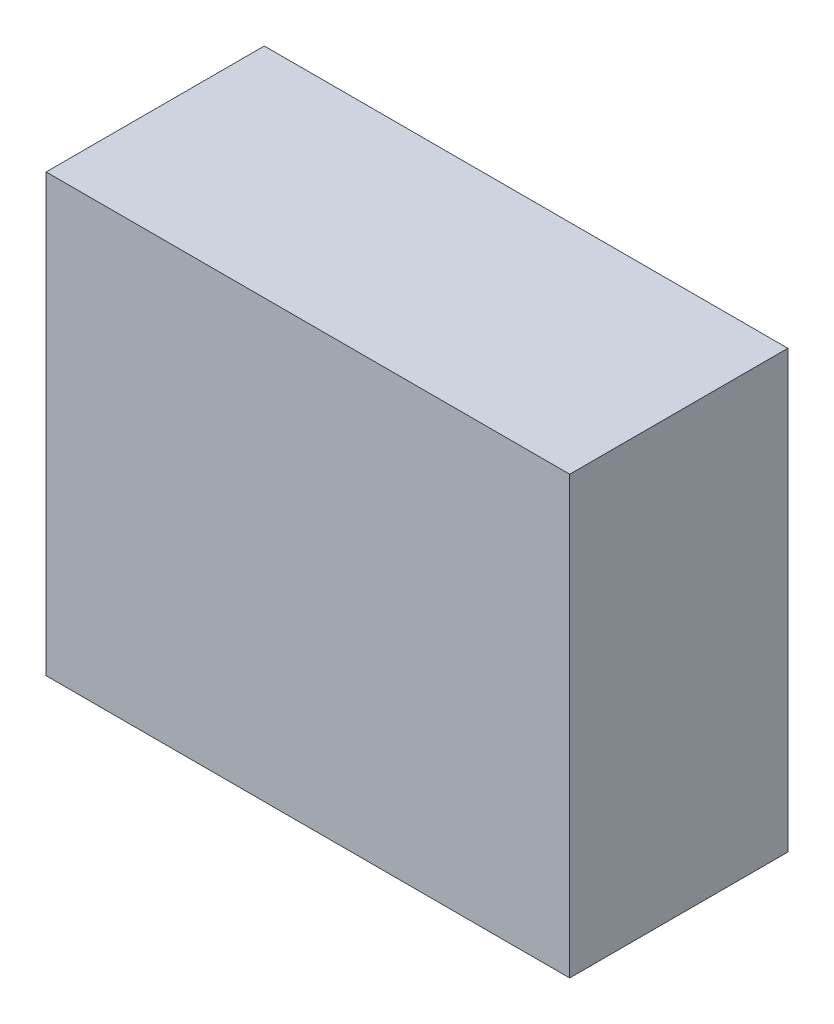
ISO-10303-21;
HEADER;
FILE_DESCRIPTION(('STEP AP214'),'2;1');
FILE_NAME('part.step','',(''),(''),'','','');
FILE_SCHEMA(('AUTOMOTIVE_DESIGN { 1 0 10303 214 1 1 1 1 }'));
ENDSEC;
DATA;
#1=APPLICATION_CONTEXT('core data for automotive mechanical design processes');
#2=APPLICATION_PROTOCOL_DEFINITION('international standard','automotive_design',2000,#1);
#3=PRODUCT_CONTEXT('',#1,'mechanical');
#4=PRODUCT('Part','Part','',(#3));
#5=PRODUCT_RELATED_PRODUCT_CATEGORY('part','',(#4));
#6=PRODUCT_DEFINITION_FORMATION('','',#4);
#7=PRODUCT_DEFINITION_CONTEXT('part definition',#1,'design');
#8=PRODUCT_DEFINITION('design','',#6,#7);
#9=PRODUCT_DEFINITION_SHAPE('','',#8);
#10=(LENGTH_UNIT() NAMED_UNIT(*) SI_UNIT(.MILLI.,.METRE.));
#11=(NAMED_UNIT(*) PLANE_ANGLE_UNIT() SI_UNIT($,.RADIAN.));
#12=(NAMED_UNIT(*) SI_UNIT($,.STERADIAN.) SOLID_ANGLE_UNIT());
#13=UNCERTAINTY_MEASURE_WITH_UNIT(LENGTH_MEASURE(1.E-05),#10,'distance_accuracy_value','');
#14=(GEOMETRIC_REPRESENTATION_CONTEXT(3) GLOBAL_UNCERTAINTY_ASSIGNED_CONTEXT((#13)) GLOBAL_UNIT_ASSIGNED_CONTEXT((#10,
#11,#12)) REPRESENTATION_CONTEXT('',''));
#15=CARTESIAN_POINT('',(0.,0.,0.));
#16=DIRECTION('',(0.,0.,1.));
#17=DIRECTION('',(1.,0.,0.));
#18=AXIS2_PLACEMENT_3D('',#15,#16,#17);
#19=CARTESIAN_POINT('',(-68.,40.,138.));
#20=DIRECTION('',(1.,0.,0.));
#21=DIRECTION('',(0.,0.,-1.));
#22=AXIS2_PLACEMENT_3D('',#19,#20,#21);
#23=PLANE('',#22);
#24=DIRECTION('',(0.,-1.,0.));
#25=VECTOR('',#24,1.);
#26=CARTESIAN_POINT('',(-68.,40.,98.));
#27=LINE('',#26,#25);
#28=CARTESIAN_POINT('',(-68.,40.,98.));
#29=VERTEX_POINT('',#28);
#30=CARTESIAN_POINT('',(-68.,-40.,98.));
#31=VERTEX_POINT('',#30);
#32=EDGE_CURVE('E105',#29,#31,#27,.T.);
#33=ORIENTED_EDGE('',*,*,#32,.T.);
#34=DIRECTION('',(0.,0.,-1.));
#35=VECTOR('',#34,1.);
#36=CARTESIAN_POINT('',(-68.,-40.,138.));
#37=LINE('',#36,#35);
#38=CARTESIAN_POINT('',(-68.,-40.,138.));
#39=VERTEX_POINT('',#38);
#40=EDGE_CURVE('E11',#39,#31,#37,.T.);
#41=ORIENTED_EDGE('',*,*,#40,.F.);
#42=DIRECTION('',(0.,-1.,0.));
#43=VECTOR('',#42,1.);
#44=CARTESIAN_POINT('',(-68.,40.,138.));
#45=LINE('',#44,#43);
#46=CARTESIAN_POINT('',(-68.,40.,138.));
#47=VERTEX_POINT('',#46);
#48=EDGE_CURVE('E89',#47,#39,#45,.T.);
#49=ORIENTED_EDGE('',*,*,#48,.F.);
#50=DIRECTION('',(0.,0.,-1.));
#51=VECTOR('',#50,1.);
#52=CARTESIAN_POINT('',(-68.,40.,138.));
#53=LINE('',#52,#51);
#54=EDGE_CURVE('E97',#47,#29,#53,.T.);
#55=ORIENTED_EDGE('',*,*,#54,.T.);
#56=EDGE_LOOP('',(#33,#41,#49,#55));
#57=FACE_BOUND('',#56,.T.);
#58=ADVANCED_FACE('F39',(#57),#23,.F.);
#59=CARTESIAN_POINT('',(-68.,-40.,138.));
#60=DIRECTION('',(0.,1.,0.));
#61=DIRECTION('',(0.,0.,1.));
#62=AXIS2_PLACEMENT_3D('',#59,#60,#61);
#63=PLANE('',#62);
#64=DIRECTION('',(1.,0.,0.));
#65=VECTOR('',#64,1.);
#66=CARTESIAN_POINT('',(-68.,-40.,98.));
#67=LINE('',#66,#65);
#68=CARTESIAN_POINT('',(28.,-40.,98.));
#69=VERTEX_POINT('',#68);
#70=EDGE_CURVE('E92',#31,#69,#67,.T.);
#71=ORIENTED_EDGE('',*,*,#70,.T.);
#72=DIRECTION('',(0.,0.,-1.));
#73=VECTOR('',#72,1.);
#74=CARTESIAN_POINT('',(28.,-40.,138.));
#75=LINE('',#74,#73);
#76=CARTESIAN_POINT('',(28.,-40.,138.));
#77=VERTEX_POINT('',#76);
#78=EDGE_CURVE('E50',#77,#69,#75,.T.);
#79=ORIENTED_EDGE('',*,*,#78,.F.);
#80=DIRECTION('',(1.,0.,0.));
#81=VECTOR('',#80,1.);
#82=CARTESIAN_POINT('',(-68.,-40.,138.));
#83=LINE('',#82,#81);
#84=EDGE_CURVE('E82',#39,#77,#83,.T.);
#85=ORIENTED_EDGE('',*,*,#84,.F.);
#86=ORIENTED_EDGE('',*,*,#40,.T.);
#87=EDGE_LOOP('',(#71,#79,#85,#86));
#88=FACE_BOUND('',#87,.T.);
#89=ADVANCED_FACE('F93',(#88),#63,.F.);
#90=CARTESIAN_POINT('',(28.,-40.,138.));
#91=DIRECTION('',(-1.,0.,0.));
#92=DIRECTION('',(0.,0.,1.));
#93=AXIS2_PLACEMENT_3D('',#90,#91,#92);
#94=PLANE('',#93);
#95=DIRECTION('',(0.,1.,0.));
#96=VECTOR('',#95,1.);
#97=CARTESIAN_POINT('',(28.,-40.,98.));
#98=LINE('',#97,#96);
#99=CARTESIAN_POINT('',(28.,40.,98.));
#100=VERTEX_POINT('',#99);
#101=EDGE_CURVE('E74',#69,#100,#98,.T.);
#102=ORIENTED_EDGE('',*,*,#101,.T.);
#103=DIRECTION('',(0.,0.,-1.));
#104=VECTOR('',#103,1.);
#105=CARTESIAN_POINT('',(28.,40.,138.));
#106=LINE('',#105,#104);
#107=CARTESIAN_POINT('',(28.,40.,138.));
#108=VERTEX_POINT('',#107);
#109=EDGE_CURVE('E94',#108,#100,#106,.T.);
#110=ORIENTED_EDGE('',*,*,#109,.F.);
#111=DIRECTION('',(0.,1.,0.));
#112=VECTOR('',#111,1.);
#113=CARTESIAN_POINT('',(28.,-40.,138.));
#114=LINE('',#113,#112);
#115=EDGE_CURVE('E88',#77,#108,#114,.T.);
#116=ORIENTED_EDGE('',*,*,#115,.F.);
#117=ORIENTED_EDGE('',*,*,#78,.T.);
#118=EDGE_LOOP('',(#102,#110,#116,#117));
#119=FACE_BOUND('',#118,.T.);
#120=ADVANCED_FACE('F96',(#119),#94,.F.);
#121=CARTESIAN_POINT('',(28.,40.,138.));
#122=DIRECTION('',(0.,-1.,0.));
#123=DIRECTION('',(0.,0.,-1.));
#124=AXIS2_PLACEMENT_3D('',#121,#122,#123);
#125=PLANE('',#124);
#126=DIRECTION('',(-1.,0.,0.));
#127=VECTOR('',#126,1.);
#128=CARTESIAN_POINT('',(28.,40.,98.));
#129=LINE('',#128,#127);
#130=EDGE_CURVE('E76',#100,#29,#129,.T.);
#131=ORIENTED_EDGE('',*,*,#130,.T.);
#132=ORIENTED_EDGE('',*,*,#54,.F.);
#133=DIRECTION('',(-1.,0.,0.));
#134=VECTOR('',#133,1.);
#135=CARTESIAN_POINT('',(28.,40.,138.));
#136=LINE('',#135,#134);
#137=EDGE_CURVE('E54',#108,#47,#136,.T.);
#138=ORIENTED_EDGE('',*,*,#137,.F.);
#139=ORIENTED_EDGE('',*,*,#109,.T.);
#140=EDGE_LOOP('',(#131,#132,#138,#139));
#141=FACE_BOUND('',#140,.T.);
#142=ADVANCED_FACE('F106',(#141),#125,.F.);
#143=CARTESIAN_POINT('',(0.,0.,138.));
#144=DIRECTION('',(0.,0.,1.));
#145=DIRECTION('',(1.,0.,0.));
#146=AXIS2_PLACEMENT_3D('',#143,#144,#145);
#147=PLANE('',#146);
#148=ORIENTED_EDGE('',*,*,#48,.T.);
#149=ORIENTED_EDGE('',*,*,#84,.T.);
#150=ORIENTED_EDGE('',*,*,#115,.T.);
#151=ORIENTED_EDGE('',*,*,#137,.T.);
#152=EDGE_LOOP('',(#148,#149,#150,#151));
#153=FACE_BOUND('',#152,.T.);
#154=ADVANCED_FACE('F86',(#153),#147,.T.);
#155=CARTESIAN_POINT('',(0.,0.,98.));
#156=DIRECTION('',(0.,0.,1.));
#157=DIRECTION('',(1.,0.,0.));
#158=AXIS2_PLACEMENT_3D('',#155,#156,#157);
#159=PLANE('',#158);
#160=ORIENTED_EDGE('',*,*,#32,.F.);
#161=ORIENTED_EDGE('',*,*,#130,.F.);
#162=ORIENTED_EDGE('',*,*,#101,.F.);
#163=ORIENTED_EDGE('',*,*,#70,.F.);
#164=EDGE_LOOP('',(#160,#161,#162,#163));
#165=FACE_BOUND('',#164,.T.);
#166=ADVANCED_FACE('F115',(#165),#159,.F.);
#167=CLOSED_SHELL('',(#58,#89,#120,#142,#154,#166));
#168=MANIFOLD_SOLID_BREP('B2',#167);
#169=ADVANCED_BREP_SHAPE_REPRESENTATION('',(#18,#168),#14);
#170=SHAPE_DEFINITION_REPRESENTATION(#9,#169);
ENDSEC;
END-ISO-10303-21;
